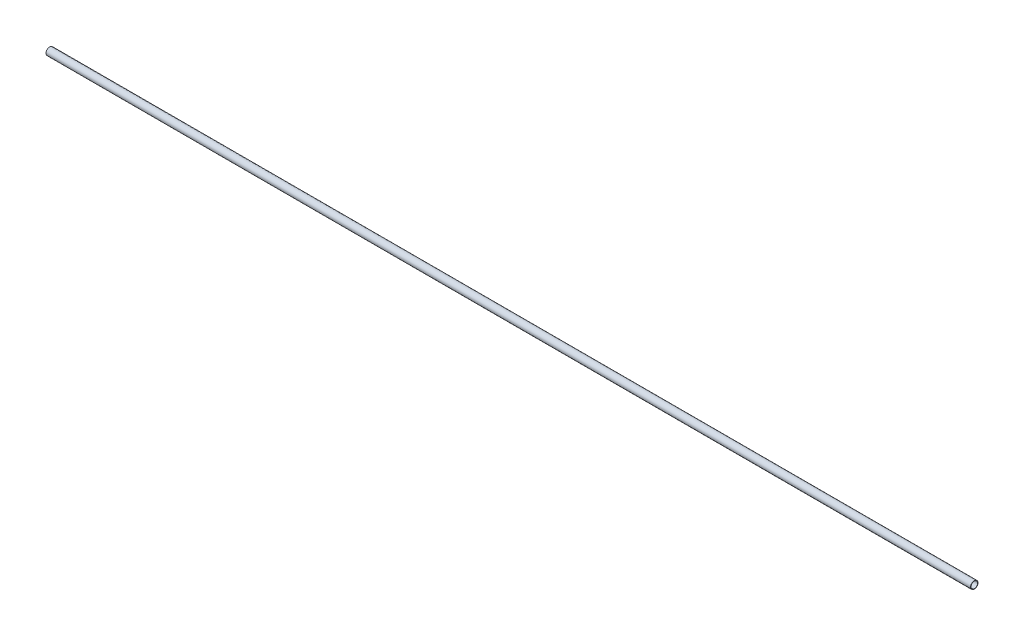
ISO-10303-21;
HEADER;
FILE_DESCRIPTION(('STEP AP214'),'2;1');
FILE_NAME('part.step','',(''),(''),'','','');
FILE_SCHEMA(('AUTOMOTIVE_DESIGN { 1 0 10303 214 1 1 1 1 }'));
ENDSEC;
DATA;
#1=APPLICATION_CONTEXT('core data for automotive mechanical design processes');
#2=APPLICATION_PROTOCOL_DEFINITION('international standard','automotive_design',2000,#1);
#3=PRODUCT_CONTEXT('',#1,'mechanical');
#4=PRODUCT('Part','Part','',(#3));
#5=PRODUCT_RELATED_PRODUCT_CATEGORY('part','',(#4));
#6=PRODUCT_DEFINITION_FORMATION('','',#4);
#7=PRODUCT_DEFINITION_CONTEXT('part definition',#1,'design');
#8=PRODUCT_DEFINITION('design','',#6,#7);
#9=PRODUCT_DEFINITION_SHAPE('','',#8);
#10=(LENGTH_UNIT() NAMED_UNIT(*) SI_UNIT(.MILLI.,.METRE.));
#11=(NAMED_UNIT(*) PLANE_ANGLE_UNIT() SI_UNIT($,.RADIAN.));
#12=(NAMED_UNIT(*) SI_UNIT($,.STERADIAN.) SOLID_ANGLE_UNIT());
#13=UNCERTAINTY_MEASURE_WITH_UNIT(LENGTH_MEASURE(1.E-05),#10,'distance_accuracy_value','');
#14=(GEOMETRIC_REPRESENTATION_CONTEXT(3) GLOBAL_UNCERTAINTY_ASSIGNED_CONTEXT((#13)) GLOBAL_UNIT_ASSIGNED_CONTEXT((#10,
#11,#12)) REPRESENTATION_CONTEXT('',''));
#15=CARTESIAN_POINT('',(0.,0.,0.));
#16=DIRECTION('',(0.,0.,1.));
#17=DIRECTION('',(1.,0.,0.));
#18=AXIS2_PLACEMENT_3D('',#15,#16,#17);
#19=CARTESIAN_POINT('',(2235.2,0.,0.));
#20=DIRECTION('',(1.,0.,0.));
#21=DIRECTION('',(0.,0.,-1.));
#22=AXIS2_PLACEMENT_3D('',#19,#20,#21);
#23=PLANE('',#22);
#24=CARTESIAN_POINT('',(2235.2,0.,0.));
#25=DIRECTION('',(1.,0.,0.));
#26=DIRECTION('',(0.,0.,-1.));
#27=AXIS2_PLACEMENT_3D('',#24,#25,#26);
#28=CIRCLE('',#27,8.9662);
#29=CARTESIAN_POINT('',(2235.2,0.,-8.9662));
#30=VERTEX_POINT('',#29);
#31=EDGE_CURVE('E10',#30,#30,#28,.T.);
#32=ORIENTED_EDGE('',*,*,#31,.T.);
#33=EDGE_LOOP('',(#32));
#34=FACE_BOUND('',#33,.T.);
#35=CARTESIAN_POINT('',(2235.2,0.,0.));
#36=DIRECTION('',(1.,0.,0.));
#37=DIRECTION('',(0.,0.,-1.));
#38=AXIS2_PLACEMENT_3D('',#35,#36,#37);
#39=CIRCLE('',#38,7.8994);
#40=CARTESIAN_POINT('',(2235.2,0.,-7.8994));
#41=VERTEX_POINT('',#40);
#42=EDGE_CURVE('E42',#41,#41,#39,.T.);
#43=ORIENTED_EDGE('',*,*,#42,.F.);
#44=EDGE_LOOP('',(#43));
#45=FACE_BOUND('',#44,.T.);
#46=ADVANCED_FACE('F31',(#34,#45),#23,.T.);
#47=CARTESIAN_POINT('',(0.,0.,0.));
#48=DIRECTION('',(1.,0.,0.));
#49=DIRECTION('',(0.,0.,-1.));
#50=AXIS2_PLACEMENT_3D('',#47,#48,#49);
#51=PLANE('',#50);
#52=CARTESIAN_POINT('',(0.,0.,0.));
#53=DIRECTION('',(1.,0.,0.));
#54=DIRECTION('',(0.,0.,-1.));
#55=AXIS2_PLACEMENT_3D('',#52,#53,#54);
#56=CIRCLE('',#55,8.9662);
#57=CARTESIAN_POINT('',(0.,0.,-8.9662));
#58=VERTEX_POINT('',#57);
#59=EDGE_CURVE('E35',#58,#58,#56,.T.);
#60=ORIENTED_EDGE('',*,*,#59,.F.);
#61=EDGE_LOOP('',(#60));
#62=FACE_BOUND('',#61,.T.);
#63=CARTESIAN_POINT('',(0.,0.,0.));
#64=DIRECTION('',(1.,0.,0.));
#65=DIRECTION('',(0.,0.,-1.));
#66=AXIS2_PLACEMENT_3D('',#63,#64,#65);
#67=CIRCLE('',#66,7.8994);
#68=CARTESIAN_POINT('',(0.,0.,-7.8994));
#69=VERTEX_POINT('',#68);
#70=EDGE_CURVE('E44',#69,#69,#67,.T.);
#71=ORIENTED_EDGE('',*,*,#70,.T.);
#72=EDGE_LOOP('',(#71));
#73=FACE_BOUND('',#72,.T.);
#74=ADVANCED_FACE('F54',(#62,#73),#51,.F.);
#75=CARTESIAN_POINT('',(2235.2,0.,0.));
#76=DIRECTION('',(-1.,0.,0.));
#77=DIRECTION('',(0.,0.,1.));
#78=AXIS2_PLACEMENT_3D('',#75,#76,#77);
#79=CYLINDRICAL_SURFACE('',#78,8.9662);
#80=ORIENTED_EDGE('',*,*,#31,.F.);
#81=EDGE_LOOP('',(#80));
#82=FACE_BOUND('',#81,.T.);
#83=ORIENTED_EDGE('',*,*,#59,.T.);
#84=EDGE_LOOP('',(#83));
#85=FACE_BOUND('',#84,.T.);
#86=ADVANCED_FACE('F33',(#82,#85),#79,.T.);
#87=CARTESIAN_POINT('',(2235.2,0.,0.));
#88=DIRECTION('',(-1.,0.,0.));
#89=DIRECTION('',(0.,0.,1.));
#90=AXIS2_PLACEMENT_3D('',#87,#88,#89);
#91=CYLINDRICAL_SURFACE('',#90,7.8994);
#92=ORIENTED_EDGE('',*,*,#42,.T.);
#93=EDGE_LOOP('',(#92));
#94=FACE_BOUND('',#93,.T.);
#95=ORIENTED_EDGE('',*,*,#70,.F.);
#96=EDGE_LOOP('',(#95));
#97=FACE_BOUND('',#96,.T.);
#98=ADVANCED_FACE('F50',(#94,#97),#91,.F.);
#99=CLOSED_SHELL('',(#46,#74,#86,#98));
#100=MANIFOLD_SOLID_BREP('B2',#99);
#101=ADVANCED_BREP_SHAPE_REPRESENTATION('',(#18,#100),#14);
#102=SHAPE_DEFINITION_REPRESENTATION(#9,#101);
ENDSEC;
END-ISO-10303-21;
